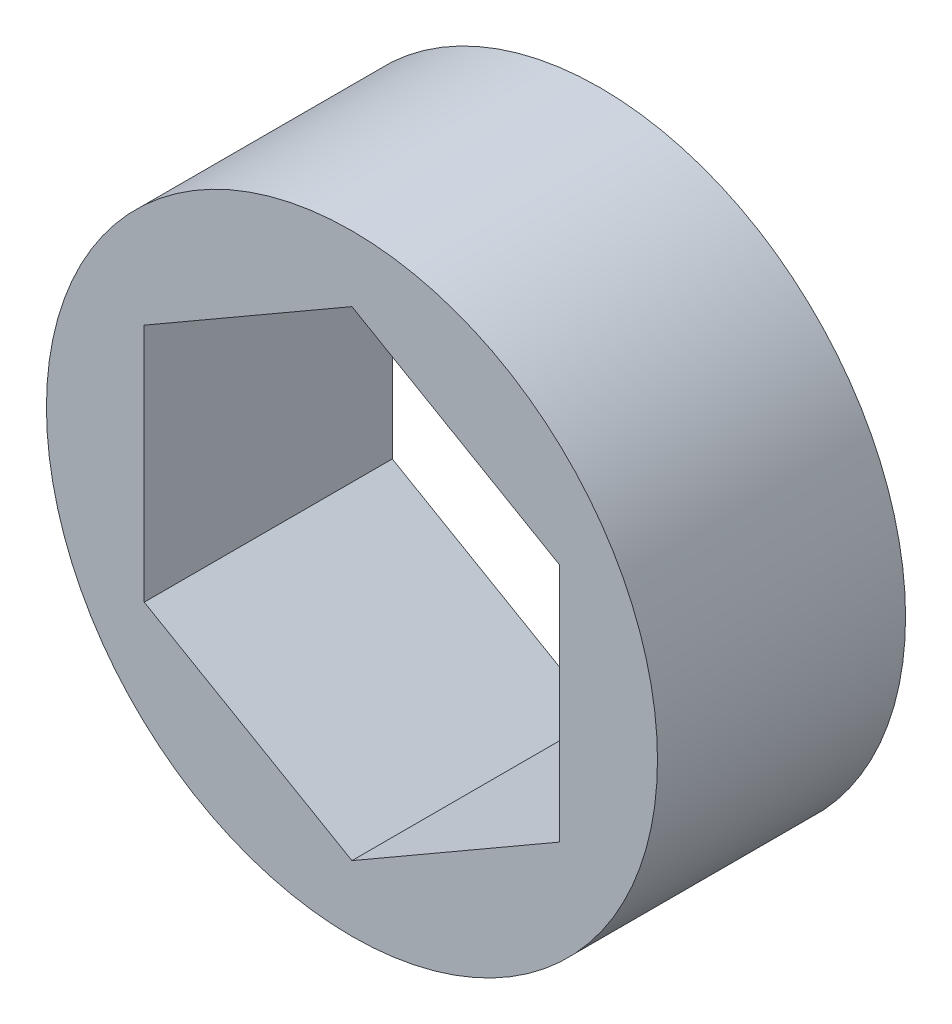
ISO-10303-21;
HEADER;
FILE_DESCRIPTION(('STEP AP214'),'2;1');
FILE_NAME('part.step','',(''),(''),'','','');
FILE_SCHEMA(('AUTOMOTIVE_DESIGN { 1 0 10303 214 1 1 1 1 }'));
ENDSEC;
DATA;
#1=APPLICATION_CONTEXT('core data for automotive mechanical design processes');
#2=APPLICATION_PROTOCOL_DEFINITION('international standard','automotive_design',2000,#1);
#3=PRODUCT_CONTEXT('',#1,'mechanical');
#4=PRODUCT('Part','Part','',(#3));
#5=PRODUCT_RELATED_PRODUCT_CATEGORY('part','',(#4));
#6=PRODUCT_DEFINITION_FORMATION('','',#4);
#7=PRODUCT_DEFINITION_CONTEXT('part definition',#1,'design');
#8=PRODUCT_DEFINITION('design','',#6,#7);
#9=PRODUCT_DEFINITION_SHAPE('','',#8);
#10=(LENGTH_UNIT() NAMED_UNIT(*) SI_UNIT(.MILLI.,.METRE.));
#11=(NAMED_UNIT(*) PLANE_ANGLE_UNIT() SI_UNIT($,.RADIAN.));
#12=(NAMED_UNIT(*) SI_UNIT($,.STERADIAN.) SOLID_ANGLE_UNIT());
#13=UNCERTAINTY_MEASURE_WITH_UNIT(LENGTH_MEASURE(1.E-05),#10,'distance_accuracy_value','');
#14=(GEOMETRIC_REPRESENTATION_CONTEXT(3) GLOBAL_UNCERTAINTY_ASSIGNED_CONTEXT((#13)) GLOBAL_UNIT_ASSIGNED_CONTEXT((#10,
#11,#12)) REPRESENTATION_CONTEXT('',''));
#15=CARTESIAN_POINT('',(0.,0.,0.));
#16=DIRECTION('',(0.,0.,1.));
#17=DIRECTION('',(1.,0.,0.));
#18=AXIS2_PLACEMENT_3D('',#15,#16,#17);
#19=CARTESIAN_POINT('',(0.,0.,7.7343));
#20=DIRECTION('',(0.,0.,1.));
#21=DIRECTION('',(1.,0.,0.));
#22=AXIS2_PLACEMENT_3D('',#19,#20,#21);
#23=PLANE('',#22);
#24=CARTESIAN_POINT('',(0.,0.,7.7343));
#25=DIRECTION('',(0.,0.,1.));
#26=DIRECTION('',(1.,0.,0.));
#27=AXIS2_PLACEMENT_3D('',#24,#25,#26);
#28=CIRCLE('',#27,9.525);
#29=CARTESIAN_POINT('',(9.525,0.,7.7343));
#30=VERTEX_POINT('',#29);
#31=EDGE_CURVE('E11',#30,#30,#28,.T.);
#32=ORIENTED_EDGE('',*,*,#31,.T.);
#33=EDGE_LOOP('',(#32));
#34=FACE_BOUND('',#33,.T.);
#35=DIRECTION('',(-0.866025403784438,-0.500000000000001,0.));
#36=VECTOR('',#35,1.);
#37=CARTESIAN_POINT('',(0.,7.47899538708241,7.7343));
#38=LINE('',#37,#36);
#39=CARTESIAN_POINT('',(0.,7.47899538708241,7.7343));
#40=VERTEX_POINT('',#39);
#41=CARTESIAN_POINT('',(-6.47700000000001,3.73949769354119,7.7343));
#42=VERTEX_POINT('',#41);
#43=EDGE_CURVE('E108',#40,#42,#38,.T.);
#44=ORIENTED_EDGE('',*,*,#43,.F.);
#45=DIRECTION('',(-0.866025403784441,0.499999999999995,0.));
#46=VECTOR('',#45,1.);
#47=CARTESIAN_POINT('',(6.47699999999996,3.73949769354128,7.7343));
#48=LINE('',#47,#46);
#49=CARTESIAN_POINT('',(6.47699999999996,3.73949769354128,7.7343));
#50=VERTEX_POINT('',#49);
#51=EDGE_CURVE('E99',#50,#40,#48,.T.);
#52=ORIENTED_EDGE('',*,*,#51,.F.);
#53=DIRECTION('',(0.,1.,0.));
#54=VECTOR('',#53,1.);
#55=CARTESIAN_POINT('',(6.47700000000003,-3.73949769354115,7.7343));
#56=LINE('',#55,#54);
#57=CARTESIAN_POINT('',(6.47700000000003,-3.73949769354115,7.7343));
#58=VERTEX_POINT('',#57);
#59=EDGE_CURVE('E133',#58,#50,#56,.T.);
#60=ORIENTED_EDGE('',*,*,#59,.F.);
#61=DIRECTION('',(0.866025403784435,0.500000000000007,0.));
#62=VECTOR('',#61,1.);
#63=CARTESIAN_POINT('',(0.,-7.47899538708241,7.7343));
#64=LINE('',#63,#62);
#65=CARTESIAN_POINT('',(0.,-7.47899538708241,7.7343));
#66=VERTEX_POINT('',#65);
#67=EDGE_CURVE('E130',#66,#58,#64,.T.);
#68=ORIENTED_EDGE('',*,*,#67,.F.);
#69=DIRECTION('',(0.866025403784442,-0.499999999999995,0.));
#70=VECTOR('',#69,1.);
#71=CARTESIAN_POINT('',(-6.47699999999998,-3.73949769354124,7.7343));
#72=LINE('',#71,#70);
#73=CARTESIAN_POINT('',(-6.47699999999998,-3.73949769354124,7.7343));
#74=VERTEX_POINT('',#73);
#75=EDGE_CURVE('E125',#74,#66,#72,.T.);
#76=ORIENTED_EDGE('',*,*,#75,.F.);
#77=DIRECTION('',(0.,-1.,0.));
#78=VECTOR('',#77,1.);
#79=CARTESIAN_POINT('',(-6.47700000000001,3.73949769354119,7.7343));
#80=LINE('',#79,#78);
#81=EDGE_CURVE('E121',#42,#74,#80,.T.);
#82=ORIENTED_EDGE('',*,*,#81,.F.);
#83=EDGE_LOOP('',(#44,#52,#60,#68,#76,#82));
#84=FACE_BOUND('',#83,.T.);
#85=ADVANCED_FACE('F45',(#34,#84),#23,.T.);
#86=CARTESIAN_POINT('',(0.,0.,0.));
#87=DIRECTION('',(0.,0.,1.));
#88=DIRECTION('',(1.,0.,0.));
#89=AXIS2_PLACEMENT_3D('',#86,#87,#88);
#90=PLANE('',#89);
#91=CARTESIAN_POINT('',(0.,0.,0.));
#92=DIRECTION('',(0.,0.,1.));
#93=DIRECTION('',(1.,0.,0.));
#94=AXIS2_PLACEMENT_3D('',#91,#92,#93);
#95=CIRCLE('',#94,9.525);
#96=CARTESIAN_POINT('',(9.525,0.,0.));
#97=VERTEX_POINT('',#96);
#98=EDGE_CURVE('E49',#97,#97,#95,.T.);
#99=ORIENTED_EDGE('',*,*,#98,.F.);
#100=EDGE_LOOP('',(#99));
#101=FACE_BOUND('',#100,.T.);
#102=DIRECTION('',(-0.866025403784441,0.499999999999995,0.));
#103=VECTOR('',#102,1.);
#104=CARTESIAN_POINT('',(6.47699999999996,3.73949769354128,0.));
#105=LINE('',#104,#103);
#106=CARTESIAN_POINT('',(6.47699999999996,3.73949769354128,0.));
#107=VERTEX_POINT('',#106);
#108=CARTESIAN_POINT('',(0.,7.47899538708241,0.));
#109=VERTEX_POINT('',#108);
#110=EDGE_CURVE('E69',#107,#109,#105,.T.);
#111=ORIENTED_EDGE('',*,*,#110,.T.);
#112=DIRECTION('',(-0.866025403784438,-0.500000000000001,0.));
#113=VECTOR('',#112,1.);
#114=CARTESIAN_POINT('',(0.,7.47899538708241,0.));
#115=LINE('',#114,#113);
#116=CARTESIAN_POINT('',(-6.47700000000001,3.73949769354119,0.));
#117=VERTEX_POINT('',#116);
#118=EDGE_CURVE('E115',#109,#117,#115,.T.);
#119=ORIENTED_EDGE('',*,*,#118,.T.);
#120=DIRECTION('',(0.,-1.,0.));
#121=VECTOR('',#120,1.);
#122=CARTESIAN_POINT('',(-6.47700000000001,3.73949769354119,0.));
#123=LINE('',#122,#121);
#124=CARTESIAN_POINT('',(-6.47699999999998,-3.73949769354124,0.));
#125=VERTEX_POINT('',#124);
#126=EDGE_CURVE('E140',#117,#125,#123,.T.);
#127=ORIENTED_EDGE('',*,*,#126,.T.);
#128=DIRECTION('',(0.866025403784442,-0.499999999999995,0.));
#129=VECTOR('',#128,1.);
#130=CARTESIAN_POINT('',(-6.47699999999998,-3.73949769354124,0.));
#131=LINE('',#130,#129);
#132=CARTESIAN_POINT('',(0.,-7.47899538708241,0.));
#133=VERTEX_POINT('',#132);
#134=EDGE_CURVE('E144',#125,#133,#131,.T.);
#135=ORIENTED_EDGE('',*,*,#134,.T.);
#136=DIRECTION('',(0.866025403784435,0.500000000000007,0.));
#137=VECTOR('',#136,1.);
#138=CARTESIAN_POINT('',(0.,-7.47899538708241,0.));
#139=LINE('',#138,#137);
#140=CARTESIAN_POINT('',(6.47700000000003,-3.73949769354115,0.));
#141=VERTEX_POINT('',#140);
#142=EDGE_CURVE('E148',#133,#141,#139,.T.);
#143=ORIENTED_EDGE('',*,*,#142,.T.);
#144=DIRECTION('',(0.,1.,0.));
#145=VECTOR('',#144,1.);
#146=CARTESIAN_POINT('',(6.47700000000003,-3.73949769354115,0.));
#147=LINE('',#146,#145);
#148=EDGE_CURVE('E109',#141,#107,#147,.T.);
#149=ORIENTED_EDGE('',*,*,#148,.T.);
#150=EDGE_LOOP('',(#111,#119,#127,#135,#143,#149));
#151=FACE_BOUND('',#150,.T.);
#152=ADVANCED_FACE('F172',(#101,#151),#90,.F.);
#153=CARTESIAN_POINT('',(0.,0.,7.7343));
#154=DIRECTION('',(0.,0.,-1.));
#155=DIRECTION('',(-1.,0.,0.));
#156=AXIS2_PLACEMENT_3D('',#153,#154,#155);
#157=CYLINDRICAL_SURFACE('',#156,9.525);
#158=ORIENTED_EDGE('',*,*,#31,.F.);
#159=EDGE_LOOP('',(#158));
#160=FACE_BOUND('',#159,.T.);
#161=ORIENTED_EDGE('',*,*,#98,.T.);
#162=EDGE_LOOP('',(#161));
#163=FACE_BOUND('',#162,.T.);
#164=ADVANCED_FACE('F47',(#160,#163),#157,.T.);
#165=CARTESIAN_POINT('',(6.47699999999996,3.73949769354128,7.7343));
#166=DIRECTION('',(-0.499999999999995,-0.866025403784442,0.));
#167=DIRECTION('',(0.866025403784442,-0.499999999999995,0.));
#168=AXIS2_PLACEMENT_3D('',#165,#166,#167);
#169=PLANE('',#168);
#170=ORIENTED_EDGE('',*,*,#110,.F.);
#171=DIRECTION('',(0.,0.,-1.));
#172=VECTOR('',#171,1.);
#173=CARTESIAN_POINT('',(6.47699999999996,3.73949769354128,7.7343));
#174=LINE('',#173,#172);
#175=EDGE_CURVE('E103',#50,#107,#174,.T.);
#176=ORIENTED_EDGE('',*,*,#175,.F.);
#177=ORIENTED_EDGE('',*,*,#51,.T.);
#178=DIRECTION('',(0.,0.,-1.));
#179=VECTOR('',#178,1.);
#180=CARTESIAN_POINT('',(0.,7.47899538708241,7.7343));
#181=LINE('',#180,#179);
#182=EDGE_CURVE('E102',#40,#109,#181,.T.);
#183=ORIENTED_EDGE('',*,*,#182,.T.);
#184=EDGE_LOOP('',(#170,#176,#177,#183));
#185=FACE_BOUND('',#184,.T.);
#186=ADVANCED_FACE('F101',(#185),#169,.T.);
#187=CARTESIAN_POINT('',(0.,7.47899538708241,7.7343));
#188=DIRECTION('',(0.500000000000001,-0.866025403784438,0.));
#189=DIRECTION('',(0.866025403784438,0.500000000000001,0.));
#190=AXIS2_PLACEMENT_3D('',#187,#188,#189);
#191=PLANE('',#190);
#192=ORIENTED_EDGE('',*,*,#118,.F.);
#193=ORIENTED_EDGE('',*,*,#182,.F.);
#194=ORIENTED_EDGE('',*,*,#43,.T.);
#195=DIRECTION('',(0.,0.,-1.));
#196=VECTOR('',#195,1.);
#197=CARTESIAN_POINT('',(-6.47700000000001,3.73949769354119,7.7343));
#198=LINE('',#197,#196);
#199=EDGE_CURVE('E117',#42,#117,#198,.T.);
#200=ORIENTED_EDGE('',*,*,#199,.T.);
#201=EDGE_LOOP('',(#192,#193,#194,#200));
#202=FACE_BOUND('',#201,.T.);
#203=ADVANCED_FACE('F112',(#202),#191,.T.);
#204=CARTESIAN_POINT('',(-6.47700000000001,3.73949769354119,7.7343));
#205=DIRECTION('',(1.,0.,0.));
#206=DIRECTION('',(0.,1.,0.));
#207=AXIS2_PLACEMENT_3D('',#204,#205,#206);
#208=PLANE('',#207);
#209=ORIENTED_EDGE('',*,*,#126,.F.);
#210=ORIENTED_EDGE('',*,*,#199,.F.);
#211=ORIENTED_EDGE('',*,*,#81,.T.);
#212=DIRECTION('',(0.,0.,-1.));
#213=VECTOR('',#212,1.);
#214=CARTESIAN_POINT('',(-6.47699999999998,-3.73949769354124,7.7343));
#215=LINE('',#214,#213);
#216=EDGE_CURVE('E162',#74,#125,#215,.T.);
#217=ORIENTED_EDGE('',*,*,#216,.T.);
#218=EDGE_LOOP('',(#209,#210,#211,#217));
#219=FACE_BOUND('',#218,.T.);
#220=ADVANCED_FACE('F168',(#219),#208,.T.);
#221=CARTESIAN_POINT('',(-6.47699999999998,-3.73949769354124,7.7343));
#222=DIRECTION('',(0.499999999999995,0.866025403784442,0.));
#223=DIRECTION('',(-0.866025403784442,0.499999999999995,0.));
#224=AXIS2_PLACEMENT_3D('',#221,#222,#223);
#225=PLANE('',#224);
#226=ORIENTED_EDGE('',*,*,#134,.F.);
#227=ORIENTED_EDGE('',*,*,#216,.F.);
#228=ORIENTED_EDGE('',*,*,#75,.T.);
#229=DIRECTION('',(0.,0.,-1.));
#230=VECTOR('',#229,1.);
#231=CARTESIAN_POINT('',(0.,-7.47899538708241,7.7343));
#232=LINE('',#231,#230);
#233=EDGE_CURVE('E159',#66,#133,#232,.T.);
#234=ORIENTED_EDGE('',*,*,#233,.T.);
#235=EDGE_LOOP('',(#226,#227,#228,#234));
#236=FACE_BOUND('',#235,.T.);
#237=ADVANCED_FACE('F180',(#236),#225,.T.);
#238=CARTESIAN_POINT('',(0.,-7.47899538708241,7.7343));
#239=DIRECTION('',(-0.500000000000007,0.866025403784435,0.));
#240=DIRECTION('',(-0.866025403784435,-0.500000000000007,0.));
#241=AXIS2_PLACEMENT_3D('',#238,#239,#240);
#242=PLANE('',#241);
#243=ORIENTED_EDGE('',*,*,#142,.F.);
#244=ORIENTED_EDGE('',*,*,#233,.F.);
#245=ORIENTED_EDGE('',*,*,#67,.T.);
#246=DIRECTION('',(0.,0.,-1.));
#247=VECTOR('',#246,1.);
#248=CARTESIAN_POINT('',(6.47700000000003,-3.73949769354115,7.7343));
#249=LINE('',#248,#247);
#250=EDGE_CURVE('E61',#58,#141,#249,.T.);
#251=ORIENTED_EDGE('',*,*,#250,.T.);
#252=EDGE_LOOP('',(#243,#244,#245,#251));
#253=FACE_BOUND('',#252,.T.);
#254=ADVANCED_FACE('F178',(#253),#242,.T.);
#255=CARTESIAN_POINT('',(6.47700000000003,-3.73949769354115,7.7343));
#256=DIRECTION('',(-1.,0.,0.));
#257=DIRECTION('',(0.,-1.,0.));
#258=AXIS2_PLACEMENT_3D('',#255,#256,#257);
#259=PLANE('',#258);
#260=ORIENTED_EDGE('',*,*,#148,.F.);
#261=ORIENTED_EDGE('',*,*,#250,.F.);
#262=ORIENTED_EDGE('',*,*,#59,.T.);
#263=ORIENTED_EDGE('',*,*,#175,.T.);
#264=EDGE_LOOP('',(#260,#261,#262,#263));
#265=FACE_BOUND('',#264,.T.);
#266=ADVANCED_FACE('F174',(#265),#259,.T.);
#267=CLOSED_SHELL('',(#85,#152,#164,#186,#203,#220,#237,#254,#266));
#268=MANIFOLD_SOLID_BREP('B2',#267);
#269=ADVANCED_BREP_SHAPE_REPRESENTATION('',(#18,#268),#14);
#270=SHAPE_DEFINITION_REPRESENTATION(#9,#269);
ENDSEC;
END-ISO-10303-21;
